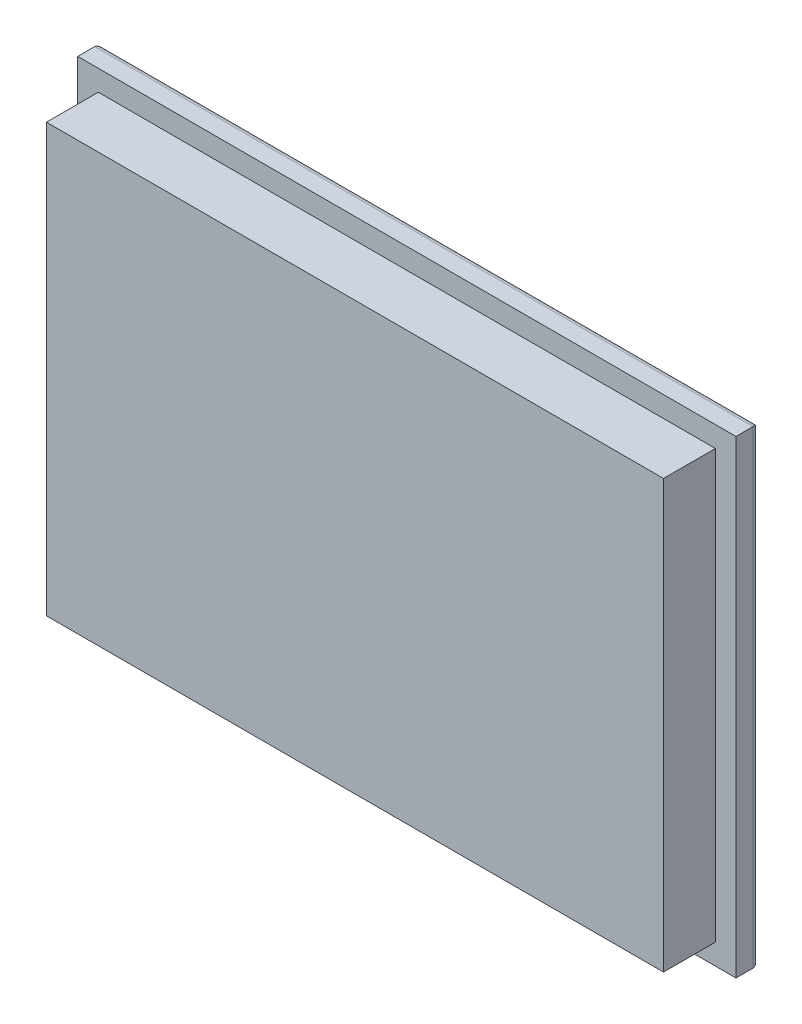
ISO-10303-21;
HEADER;
FILE_DESCRIPTION(('STEP AP214'),'2;1');
FILE_NAME('part.step','',(''),(''),'','','');
FILE_SCHEMA(('AUTOMOTIVE_DESIGN { 1 0 10303 214 1 1 1 1 }'));
ENDSEC;
DATA;
#1=APPLICATION_CONTEXT('core data for automotive mechanical design processes');
#2=APPLICATION_PROTOCOL_DEFINITION('international standard','automotive_design',2000,#1);
#3=PRODUCT_CONTEXT('',#1,'mechanical');
#4=PRODUCT('Part','Part','',(#3));
#5=PRODUCT_RELATED_PRODUCT_CATEGORY('part','',(#4));
#6=PRODUCT_DEFINITION_FORMATION('','',#4);
#7=PRODUCT_DEFINITION_CONTEXT('part definition',#1,'design');
#8=PRODUCT_DEFINITION('design','',#6,#7);
#9=PRODUCT_DEFINITION_SHAPE('','',#8);
#10=(LENGTH_UNIT() NAMED_UNIT(*) SI_UNIT(.MILLI.,.METRE.));
#11=(NAMED_UNIT(*) PLANE_ANGLE_UNIT() SI_UNIT($,.RADIAN.));
#12=(NAMED_UNIT(*) SI_UNIT($,.STERADIAN.) SOLID_ANGLE_UNIT());
#13=UNCERTAINTY_MEASURE_WITH_UNIT(LENGTH_MEASURE(1.E-05),#10,'distance_accuracy_value','');
#14=(GEOMETRIC_REPRESENTATION_CONTEXT(3) GLOBAL_UNCERTAINTY_ASSIGNED_CONTEXT((#13)) GLOBAL_UNIT_ASSIGNED_CONTEXT((#10,
#11,#12)) REPRESENTATION_CONTEXT('',''));
#15=CARTESIAN_POINT('',(0.,0.,0.));
#16=DIRECTION('',(0.,0.,1.));
#17=DIRECTION('',(1.,0.,0.));
#18=AXIS2_PLACEMENT_3D('',#15,#16,#17);
#19=CARTESIAN_POINT('',(0.,0.,7.4));
#20=DIRECTION('',(0.,0.,1.));
#21=DIRECTION('',(1.,0.,0.));
#22=AXIS2_PLACEMENT_3D('',#19,#20,#21);
#23=PLANE('',#22);
#24=DIRECTION('',(0.,-1.,0.));
#25=VECTOR('',#24,1.);
#26=CARTESIAN_POINT('',(-104.7,74.6,7.4));
#27=LINE('',#26,#25);
#28=CARTESIAN_POINT('',(-104.7,74.6,7.4));
#29=VERTEX_POINT('',#28);
#30=CARTESIAN_POINT('',(-104.7,-74.6,7.4));
#31=VERTEX_POINT('',#30);
#32=EDGE_CURVE('E247',#29,#31,#27,.T.);
#33=ORIENTED_EDGE('',*,*,#32,.T.);
#34=DIRECTION('',(1.,0.,0.));
#35=VECTOR('',#34,1.);
#36=CARTESIAN_POINT('',(-104.7,-74.6,7.4));
#37=LINE('',#36,#35);
#38=CARTESIAN_POINT('',(104.7,-74.6,7.4));
#39=VERTEX_POINT('',#38);
#40=EDGE_CURVE('E250',#31,#39,#37,.T.);
#41=ORIENTED_EDGE('',*,*,#40,.T.);
#42=DIRECTION('',(0.,1.,0.));
#43=VECTOR('',#42,1.);
#44=CARTESIAN_POINT('',(104.7,74.6,7.4));
#45=LINE('',#44,#43);
#46=CARTESIAN_POINT('',(104.7,74.6,7.4));
#47=VERTEX_POINT('',#46);
#48=EDGE_CURVE('E252',#39,#47,#45,.T.);
#49=ORIENTED_EDGE('',*,*,#48,.T.);
#50=DIRECTION('',(-1.,0.,0.));
#51=VECTOR('',#50,1.);
#52=CARTESIAN_POINT('',(-104.7,74.6,7.4));
#53=LINE('',#52,#51);
#54=EDGE_CURVE('E254',#47,#29,#53,.T.);
#55=ORIENTED_EDGE('',*,*,#54,.T.);
#56=EDGE_LOOP('',(#33,#41,#49,#55));
#57=FACE_BOUND('',#56,.T.);
#58=DIRECTION('',(1.,0.,0.));
#59=VECTOR('',#58,1.);
#60=CARTESIAN_POINT('',(-98.15,-68.,7.4));
#61=LINE('',#60,#59);
#62=CARTESIAN_POINT('',(-98.15,-68.,7.4));
#63=VERTEX_POINT('',#62);
#64=CARTESIAN_POINT('',(98.15,-68.,7.4));
#65=VERTEX_POINT('',#64);
#66=EDGE_CURVE('E232',#63,#65,#61,.T.);
#67=ORIENTED_EDGE('',*,*,#66,.F.);
#68=DIRECTION('',(0.,-1.,0.));
#69=VECTOR('',#68,1.);
#70=CARTESIAN_POINT('',(-98.15,68.,7.4));
#71=LINE('',#70,#69);
#72=CARTESIAN_POINT('',(-98.15,68.,7.4));
#73=VERTEX_POINT('',#72);
#74=EDGE_CURVE('E229',#73,#63,#71,.T.);
#75=ORIENTED_EDGE('',*,*,#74,.F.);
#76=DIRECTION('',(-1.,0.,0.));
#77=VECTOR('',#76,1.);
#78=CARTESIAN_POINT('',(-98.15,68.,7.4));
#79=LINE('',#78,#77);
#80=CARTESIAN_POINT('',(98.15,68.,7.4));
#81=VERTEX_POINT('',#80);
#82=EDGE_CURVE('E222',#81,#73,#79,.T.);
#83=ORIENTED_EDGE('',*,*,#82,.F.);
#84=DIRECTION('',(0.,1.,0.));
#85=VECTOR('',#84,1.);
#86=CARTESIAN_POINT('',(98.15,68.,7.4));
#87=LINE('',#86,#85);
#88=EDGE_CURVE('E234',#65,#81,#87,.T.);
#89=ORIENTED_EDGE('',*,*,#88,.F.);
#90=EDGE_LOOP('',(#67,#75,#83,#89));
#91=FACE_BOUND('',#90,.T.);
#92=ADVANCED_FACE('F34',(#57,#91),#23,.T.);
#93=CARTESIAN_POINT('',(-104.7,74.6,7.4));
#94=DIRECTION('',(1.,0.,0.));
#95=DIRECTION('',(0.,0.,-1.));
#96=AXIS2_PLACEMENT_3D('',#93,#94,#95);
#97=PLANE('',#96);
#98=DIRECTION('',(0.,0.,-1.));
#99=VECTOR('',#98,1.);
#100=CARTESIAN_POINT('',(-104.7,74.6,7.4));
#101=LINE('',#100,#99);
#102=CARTESIAN_POINT('',(-104.7,74.6,2.));
#103=VERTEX_POINT('',#102);
#104=EDGE_CURVE('E256',#29,#103,#101,.T.);
#105=ORIENTED_EDGE('',*,*,#104,.T.);
#106=DIRECTION('',(0.,-1.,0.));
#107=VECTOR('',#106,1.);
#108=CARTESIAN_POINT('',(-104.7,74.6,2.));
#109=LINE('',#108,#107);
#110=CARTESIAN_POINT('',(-104.7,-74.6,2.));
#111=VERTEX_POINT('',#110);
#112=EDGE_CURVE('E268',#103,#111,#109,.T.);
#113=ORIENTED_EDGE('',*,*,#112,.T.);
#114=DIRECTION('',(0.,0.,-1.));
#115=VECTOR('',#114,1.);
#116=CARTESIAN_POINT('',(-104.7,-74.6,7.4));
#117=LINE('',#116,#115);
#118=EDGE_CURVE('E265',#31,#111,#117,.T.);
#119=ORIENTED_EDGE('',*,*,#118,.F.);
#120=ORIENTED_EDGE('',*,*,#32,.F.);
#121=EDGE_LOOP('',(#105,#113,#119,#120));
#122=FACE_BOUND('',#121,.T.);
#123=ADVANCED_FACE('F392',(#122),#97,.F.);
#124=CARTESIAN_POINT('',(-104.7,-74.6,7.4));
#125=DIRECTION('',(0.,1.,0.));
#126=DIRECTION('',(-1.,0.,0.));
#127=AXIS2_PLACEMENT_3D('',#124,#125,#126);
#128=PLANE('',#127);
#129=ORIENTED_EDGE('',*,*,#118,.T.);
#130=DIRECTION('',(1.,0.,0.));
#131=VECTOR('',#130,1.);
#132=CARTESIAN_POINT('',(-104.7,-74.6,2.));
#133=LINE('',#132,#131);
#134=CARTESIAN_POINT('',(104.7,-74.6,2.));
#135=VERTEX_POINT('',#134);
#136=EDGE_CURVE('E280',#111,#135,#133,.T.);
#137=ORIENTED_EDGE('',*,*,#136,.T.);
#138=DIRECTION('',(0.,0.,-1.));
#139=VECTOR('',#138,1.);
#140=CARTESIAN_POINT('',(104.7,-74.6,7.4));
#141=LINE('',#140,#139);
#142=EDGE_CURVE('E262',#39,#135,#141,.T.);
#143=ORIENTED_EDGE('',*,*,#142,.F.);
#144=ORIENTED_EDGE('',*,*,#40,.F.);
#145=EDGE_LOOP('',(#129,#137,#143,#144));
#146=FACE_BOUND('',#145,.T.);
#147=ADVANCED_FACE('F398',(#146),#128,.F.);
#148=CARTESIAN_POINT('',(104.7,74.6,7.4));
#149=DIRECTION('',(-1.,0.,0.));
#150=DIRECTION('',(0.,-1.,0.));
#151=AXIS2_PLACEMENT_3D('',#148,#149,#150);
#152=PLANE('',#151);
#153=ORIENTED_EDGE('',*,*,#142,.T.);
#154=DIRECTION('',(0.,1.,0.));
#155=VECTOR('',#154,1.);
#156=CARTESIAN_POINT('',(104.7,74.6,2.));
#157=LINE('',#156,#155);
#158=CARTESIAN_POINT('',(104.7,74.6,2.));
#159=VERTEX_POINT('',#158);
#160=EDGE_CURVE('E282',#135,#159,#157,.T.);
#161=ORIENTED_EDGE('',*,*,#160,.T.);
#162=DIRECTION('',(0.,0.,-1.));
#163=VECTOR('',#162,1.);
#164=CARTESIAN_POINT('',(104.7,74.6,7.4));
#165=LINE('',#164,#163);
#166=EDGE_CURVE('E259',#47,#159,#165,.T.);
#167=ORIENTED_EDGE('',*,*,#166,.F.);
#168=ORIENTED_EDGE('',*,*,#48,.F.);
#169=EDGE_LOOP('',(#153,#161,#167,#168));
#170=FACE_BOUND('',#169,.T.);
#171=ADVANCED_FACE('F411',(#170),#152,.F.);
#172=CARTESIAN_POINT('',(-104.7,74.6,7.4));
#173=DIRECTION('',(0.,-1.,0.));
#174=DIRECTION('',(1.,0.,0.));
#175=AXIS2_PLACEMENT_3D('',#172,#173,#174);
#176=PLANE('',#175);
#177=ORIENTED_EDGE('',*,*,#166,.T.);
#178=DIRECTION('',(-1.,0.,0.));
#179=VECTOR('',#178,1.);
#180=CARTESIAN_POINT('',(-104.7,74.6,2.));
#181=LINE('',#180,#179);
#182=EDGE_CURVE('E192',#159,#103,#181,.T.);
#183=ORIENTED_EDGE('',*,*,#182,.T.);
#184=ORIENTED_EDGE('',*,*,#104,.F.);
#185=ORIENTED_EDGE('',*,*,#54,.F.);
#186=EDGE_LOOP('',(#177,#183,#184,#185));
#187=FACE_BOUND('',#186,.T.);
#188=ADVANCED_FACE('F408',(#187),#176,.F.);
#189=CARTESIAN_POINT('',(0.,0.,0.));
#190=DIRECTION('',(0.,0.,1.));
#191=DIRECTION('',(1.,0.,0.));
#192=AXIS2_PLACEMENT_3D('',#189,#190,#191);
#193=PLANE('',#192);
#194=DIRECTION('',(-1.,0.,0.));
#195=VECTOR('',#194,1.);
#196=CARTESIAN_POINT('',(99.7,-69.6,0.));
#197=LINE('',#196,#195);
#198=CARTESIAN_POINT('',(96.7,-69.6,0.));
#199=VERTEX_POINT('',#198);
#200=CARTESIAN_POINT('',(-96.7,-69.6,0.));
#201=VERTEX_POINT('',#200);
#202=EDGE_CURVE('E358',#199,#201,#197,.T.);
#203=ORIENTED_EDGE('',*,*,#202,.F.);
#204=CARTESIAN_POINT('',(96.7,-66.6,0.));
#205=DIRECTION('',(0.,0.,1.));
#206=DIRECTION('',(1.,0.,0.));
#207=AXIS2_PLACEMENT_3D('',#204,#205,#206);
#208=CIRCLE('',#207,3.);
#209=CARTESIAN_POINT('',(99.7,-66.6,0.));
#210=VERTEX_POINT('',#209);
#211=EDGE_CURVE('E11',#199,#210,#208,.T.);
#212=ORIENTED_EDGE('',*,*,#211,.T.);
#213=DIRECTION('',(0.,-1.,0.));
#214=VECTOR('',#213,1.);
#215=CARTESIAN_POINT('',(99.7,69.6,0.));
#216=LINE('',#215,#214);
#217=CARTESIAN_POINT('',(99.7,66.6,0.));
#218=VERTEX_POINT('',#217);
#219=EDGE_CURVE('E329',#218,#210,#216,.T.);
#220=ORIENTED_EDGE('',*,*,#219,.F.);
#221=CARTESIAN_POINT('',(96.7,66.6,0.));
#222=DIRECTION('',(0.,0.,1.));
#223=DIRECTION('',(1.,0.,0.));
#224=AXIS2_PLACEMENT_3D('',#221,#222,#223);
#225=CIRCLE('',#224,3.);
#226=CARTESIAN_POINT('',(96.7,69.6,0.));
#227=VERTEX_POINT('',#226);
#228=EDGE_CURVE('E42',#218,#227,#225,.T.);
#229=ORIENTED_EDGE('',*,*,#228,.T.);
#230=DIRECTION('',(1.,0.,0.));
#231=VECTOR('',#230,1.);
#232=CARTESIAN_POINT('',(99.7,69.6,0.));
#233=LINE('',#232,#231);
#234=CARTESIAN_POINT('',(-96.7,69.6,0.));
#235=VERTEX_POINT('',#234);
#236=EDGE_CURVE('E328',#235,#227,#233,.T.);
#237=ORIENTED_EDGE('',*,*,#236,.F.);
#238=CARTESIAN_POINT('',(-96.7,66.6,0.));
#239=DIRECTION('',(0.,0.,1.));
#240=DIRECTION('',(1.,0.,0.));
#241=AXIS2_PLACEMENT_3D('',#238,#239,#240);
#242=CIRCLE('',#241,3.);
#243=CARTESIAN_POINT('',(-99.7,66.6,0.));
#244=VERTEX_POINT('',#243);
#245=EDGE_CURVE('E323',#235,#244,#242,.T.);
#246=ORIENTED_EDGE('',*,*,#245,.T.);
#247=DIRECTION('',(0.,1.,0.));
#248=VECTOR('',#247,1.);
#249=CARTESIAN_POINT('',(-99.7,69.6,0.));
#250=LINE('',#249,#248);
#251=CARTESIAN_POINT('',(-99.7,-66.6,0.));
#252=VERTEX_POINT('',#251);
#253=EDGE_CURVE('E336',#252,#244,#250,.T.);
#254=ORIENTED_EDGE('',*,*,#253,.F.);
#255=CARTESIAN_POINT('',(-96.7,-66.6,0.));
#256=DIRECTION('',(0.,0.,1.));
#257=DIRECTION('',(1.,0.,0.));
#258=AXIS2_PLACEMENT_3D('',#255,#256,#257);
#259=CIRCLE('',#258,3.);
#260=EDGE_CURVE('E321',#252,#201,#259,.T.);
#261=ORIENTED_EDGE('',*,*,#260,.T.);
#262=EDGE_LOOP('',(#203,#212,#220,#229,#237,#246,#254,#261));
#263=FACE_BOUND('',#262,.T.);
#264=DIRECTION('',(1.,0.,0.));
#265=VECTOR('',#264,1.);
#266=CARTESIAN_POINT('',(0.,-72.6,0.));
#267=LINE('',#266,#265);
#268=CARTESIAN_POINT('',(102.7,-72.6,0.));
#269=VERTEX_POINT('',#268);
#270=CARTESIAN_POINT('',(-102.7,-72.6,0.));
#271=VERTEX_POINT('',#270);
#272=EDGE_CURVE('E275',#269,#271,#267,.F.);
#273=ORIENTED_EDGE('',*,*,#272,.T.);
#274=DIRECTION('',(0.,-1.,0.));
#275=VECTOR('',#274,1.);
#276=CARTESIAN_POINT('',(-102.7,0.,0.));
#277=LINE('',#276,#275);
#278=CARTESIAN_POINT('',(-102.7,72.6,0.));
#279=VERTEX_POINT('',#278);
#280=EDGE_CURVE('E277',#271,#279,#277,.F.);
#281=ORIENTED_EDGE('',*,*,#280,.T.);
#282=DIRECTION('',(-1.,0.,0.));
#283=VECTOR('',#282,1.);
#284=CARTESIAN_POINT('',(0.,72.6,0.));
#285=LINE('',#284,#283);
#286=CARTESIAN_POINT('',(102.7,72.6,0.));
#287=VERTEX_POINT('',#286);
#288=EDGE_CURVE('E271',#279,#287,#285,.F.);
#289=ORIENTED_EDGE('',*,*,#288,.T.);
#290=DIRECTION('',(0.,1.,0.));
#291=VECTOR('',#290,1.);
#292=CARTESIAN_POINT('',(102.7,0.,0.));
#293=LINE('',#292,#291);
#294=EDGE_CURVE('E273',#287,#269,#293,.F.);
#295=ORIENTED_EDGE('',*,*,#294,.T.);
#296=EDGE_LOOP('',(#273,#281,#289,#295));
#297=FACE_BOUND('',#296,.T.);
#298=ADVANCED_FACE('F326',(#263,#297),#193,.F.);
#299=CARTESIAN_POINT('',(-98.15,68.,23.9));
#300=DIRECTION('',(1.,0.,0.));
#301=DIRECTION('',(0.,1.,0.));
#302=AXIS2_PLACEMENT_3D('',#299,#300,#301);
#303=PLANE('',#302);
#304=ORIENTED_EDGE('',*,*,#74,.T.);
#305=DIRECTION('',(0.,0.,-1.));
#306=VECTOR('',#305,1.);
#307=CARTESIAN_POINT('',(-98.15,-68.,23.9));
#308=LINE('',#307,#306);
#309=CARTESIAN_POINT('',(-98.15,-68.,23.9));
#310=VERTEX_POINT('',#309);
#311=EDGE_CURVE('E245',#310,#63,#308,.T.);
#312=ORIENTED_EDGE('',*,*,#311,.F.);
#313=DIRECTION('',(0.,-1.,0.));
#314=VECTOR('',#313,1.);
#315=CARTESIAN_POINT('',(-98.15,68.,23.9));
#316=LINE('',#315,#314);
#317=CARTESIAN_POINT('',(-98.15,68.,23.9));
#318=VERTEX_POINT('',#317);
#319=EDGE_CURVE('E218',#318,#310,#316,.T.);
#320=ORIENTED_EDGE('',*,*,#319,.F.);
#321=DIRECTION('',(0.,0.,-1.));
#322=VECTOR('',#321,1.);
#323=CARTESIAN_POINT('',(-98.15,68.,23.9));
#324=LINE('',#323,#322);
#325=EDGE_CURVE('E228',#318,#73,#324,.T.);
#326=ORIENTED_EDGE('',*,*,#325,.T.);
#327=EDGE_LOOP('',(#304,#312,#320,#326));
#328=FACE_BOUND('',#327,.T.);
#329=ADVANCED_FACE('F404',(#328),#303,.F.);
#330=CARTESIAN_POINT('',(-98.15,-68.,23.9));
#331=DIRECTION('',(0.,1.,0.));
#332=DIRECTION('',(-1.,0.,0.));
#333=AXIS2_PLACEMENT_3D('',#330,#331,#332);
#334=PLANE('',#333);
#335=ORIENTED_EDGE('',*,*,#66,.T.);
#336=DIRECTION('',(0.,0.,-1.));
#337=VECTOR('',#336,1.);
#338=CARTESIAN_POINT('',(98.15,-68.,23.9));
#339=LINE('',#338,#337);
#340=CARTESIAN_POINT('',(98.15,-68.,23.9));
#341=VERTEX_POINT('',#340);
#342=EDGE_CURVE('E242',#341,#65,#339,.T.);
#343=ORIENTED_EDGE('',*,*,#342,.F.);
#344=DIRECTION('',(1.,0.,0.));
#345=VECTOR('',#344,1.);
#346=CARTESIAN_POINT('',(-98.15,-68.,23.9));
#347=LINE('',#346,#345);
#348=EDGE_CURVE('E221',#310,#341,#347,.T.);
#349=ORIENTED_EDGE('',*,*,#348,.F.);
#350=ORIENTED_EDGE('',*,*,#311,.T.);
#351=EDGE_LOOP('',(#335,#343,#349,#350));
#352=FACE_BOUND('',#351,.T.);
#353=ADVANCED_FACE('F514',(#352),#334,.F.);
#354=CARTESIAN_POINT('',(98.15,68.,23.9));
#355=DIRECTION('',(-1.,0.,0.));
#356=DIRECTION('',(0.,-1.,0.));
#357=AXIS2_PLACEMENT_3D('',#354,#355,#356);
#358=PLANE('',#357);
#359=ORIENTED_EDGE('',*,*,#88,.T.);
#360=DIRECTION('',(0.,0.,-1.));
#361=VECTOR('',#360,1.);
#362=CARTESIAN_POINT('',(98.15,68.,23.9));
#363=LINE('',#362,#361);
#364=CARTESIAN_POINT('',(98.15,68.,23.9));
#365=VERTEX_POINT('',#364);
#366=EDGE_CURVE('E240',#365,#81,#363,.T.);
#367=ORIENTED_EDGE('',*,*,#366,.F.);
#368=DIRECTION('',(0.,1.,0.));
#369=VECTOR('',#368,1.);
#370=CARTESIAN_POINT('',(98.15,68.,23.9));
#371=LINE('',#370,#369);
#372=EDGE_CURVE('E224',#341,#365,#371,.T.);
#373=ORIENTED_EDGE('',*,*,#372,.F.);
#374=ORIENTED_EDGE('',*,*,#342,.T.);
#375=EDGE_LOOP('',(#359,#367,#373,#374));
#376=FACE_BOUND('',#375,.T.);
#377=ADVANCED_FACE('F506',(#376),#358,.F.);
#378=CARTESIAN_POINT('',(-98.15,68.,23.9));
#379=DIRECTION('',(0.,-1.,0.));
#380=DIRECTION('',(1.,0.,0.));
#381=AXIS2_PLACEMENT_3D('',#378,#379,#380);
#382=PLANE('',#381);
#383=ORIENTED_EDGE('',*,*,#82,.T.);
#384=ORIENTED_EDGE('',*,*,#325,.F.);
#385=DIRECTION('',(-1.,0.,0.));
#386=VECTOR('',#385,1.);
#387=CARTESIAN_POINT('',(-98.15,68.,23.9));
#388=LINE('',#387,#386);
#389=EDGE_CURVE('E226',#365,#318,#388,.T.);
#390=ORIENTED_EDGE('',*,*,#389,.F.);
#391=ORIENTED_EDGE('',*,*,#366,.T.);
#392=EDGE_LOOP('',(#383,#384,#390,#391));
#393=FACE_BOUND('',#392,.T.);
#394=ADVANCED_FACE('F498',(#393),#382,.F.);
#395=CARTESIAN_POINT('',(0.,0.,23.9));
#396=DIRECTION('',(0.,0.,1.));
#397=DIRECTION('',(1.,0.,0.));
#398=AXIS2_PLACEMENT_3D('',#395,#396,#397);
#399=PLANE('',#398);
#400=ORIENTED_EDGE('',*,*,#319,.T.);
#401=ORIENTED_EDGE('',*,*,#348,.T.);
#402=ORIENTED_EDGE('',*,*,#372,.T.);
#403=ORIENTED_EDGE('',*,*,#389,.T.);
#404=EDGE_LOOP('',(#400,#401,#402,#403));
#405=FACE_BOUND('',#404,.T.);
#406=ADVANCED_FACE('F434',(#405),#399,.T.);
#407=CARTESIAN_POINT('',(102.7,74.6,2.));
#408=DIRECTION('',(0.,1.,0.));
#409=DIRECTION('',(-1.,0.,0.));
#410=AXIS2_PLACEMENT_3D('',#407,#408,#409);
#411=CYLINDRICAL_SURFACE('',#410,2.);
#412=CARTESIAN_POINT('',(102.7,-72.6,2.));
#413=DIRECTION('',(0.707106781186547,0.707106781186548,0.));
#414=DIRECTION('',(-0.707106781186548,0.707106781186547,0.));
#415=AXIS2_PLACEMENT_3D('',#412,#413,#414);
#416=ELLIPSE('',#415,2.82842712474619,2.);
#417=EDGE_CURVE('E288',#269,#135,#416,.F.);
#418=ORIENTED_EDGE('',*,*,#417,.F.);
#419=ORIENTED_EDGE('',*,*,#294,.F.);
#420=CARTESIAN_POINT('',(102.7,72.6,2.));
#421=DIRECTION('',(-0.707106781186548,0.707106781186547,0.));
#422=DIRECTION('',(-0.707106781186547,-0.707106781186548,0.));
#423=AXIS2_PLACEMENT_3D('',#420,#421,#422);
#424=ELLIPSE('',#423,2.82842712474619,2.);
#425=EDGE_CURVE('E291',#159,#287,#424,.T.);
#426=ORIENTED_EDGE('',*,*,#425,.F.);
#427=ORIENTED_EDGE('',*,*,#160,.F.);
#428=EDGE_LOOP('',(#418,#419,#426,#427));
#429=FACE_BOUND('',#428,.T.);
#430=ADVANCED_FACE('F430',(#429),#411,.T.);
#431=CARTESIAN_POINT('',(-104.7,72.6,2.));
#432=DIRECTION('',(-1.,0.,0.));
#433=DIRECTION('',(0.,-1.,0.));
#434=AXIS2_PLACEMENT_3D('',#431,#432,#433);
#435=CYLINDRICAL_SURFACE('',#434,2.);
#436=ORIENTED_EDGE('',*,*,#425,.T.);
#437=ORIENTED_EDGE('',*,*,#288,.F.);
#438=CARTESIAN_POINT('',(-102.7,72.6,2.));
#439=DIRECTION('',(-0.707106781186547,-0.707106781186547,0.));
#440=DIRECTION('',(-0.707106781186548,0.707106781186547,0.));
#441=AXIS2_PLACEMENT_3D('',#438,#439,#440);
#442=ELLIPSE('',#441,2.82842712474619,2.);
#443=EDGE_CURVE('E286',#103,#279,#442,.T.);
#444=ORIENTED_EDGE('',*,*,#443,.F.);
#445=ORIENTED_EDGE('',*,*,#182,.F.);
#446=EDGE_LOOP('',(#436,#437,#444,#445));
#447=FACE_BOUND('',#446,.T.);
#448=ADVANCED_FACE('F426',(#447),#435,.T.);
#449=CARTESIAN_POINT('',(-104.7,-72.6,2.));
#450=DIRECTION('',(1.,0.,0.));
#451=DIRECTION('',(0.,1.,0.));
#452=AXIS2_PLACEMENT_3D('',#449,#450,#451);
#453=CYLINDRICAL_SURFACE('',#452,2.);
#454=ORIENTED_EDGE('',*,*,#417,.T.);
#455=ORIENTED_EDGE('',*,*,#136,.F.);
#456=CARTESIAN_POINT('',(-102.7,-72.6,2.));
#457=DIRECTION('',(0.707106781186548,-0.707106781186547,0.));
#458=DIRECTION('',(0.707106781186547,0.707106781186548,0.));
#459=AXIS2_PLACEMENT_3D('',#456,#457,#458);
#460=ELLIPSE('',#459,2.82842712474619,2.);
#461=EDGE_CURVE('E201',#271,#111,#460,.F.);
#462=ORIENTED_EDGE('',*,*,#461,.F.);
#463=ORIENTED_EDGE('',*,*,#272,.F.);
#464=EDGE_LOOP('',(#454,#455,#462,#463));
#465=FACE_BOUND('',#464,.T.);
#466=ADVANCED_FACE('F422',(#465),#453,.T.);
#467=CARTESIAN_POINT('',(-102.7,74.6,2.));
#468=DIRECTION('',(0.,-1.,0.));
#469=DIRECTION('',(0.,0.,-1.));
#470=AXIS2_PLACEMENT_3D('',#467,#468,#469);
#471=CYLINDRICAL_SURFACE('',#470,2.);
#472=ORIENTED_EDGE('',*,*,#443,.T.);
#473=ORIENTED_EDGE('',*,*,#280,.F.);
#474=ORIENTED_EDGE('',*,*,#461,.T.);
#475=ORIENTED_EDGE('',*,*,#112,.F.);
#476=EDGE_LOOP('',(#472,#473,#474,#475));
#477=FACE_BOUND('',#476,.T.);
#478=ADVANCED_FACE('F419',(#477),#471,.T.);
#479=CARTESIAN_POINT('',(0.,0.,0.5));
#480=DIRECTION('',(0.,0.,-1.));
#481=DIRECTION('',(-1.,0.,0.));
#482=AXIS2_PLACEMENT_3D('',#479,#480,#481);
#483=PLANE('',#482);
#484=DIRECTION('',(-1.,0.,0.));
#485=VECTOR('',#484,1.);
#486=CARTESIAN_POINT('',(99.7,-69.6,0.5));
#487=LINE('',#486,#485);
#488=CARTESIAN_POINT('',(96.7,-69.6,0.5));
#489=VERTEX_POINT('',#488);
#490=CARTESIAN_POINT('',(-96.7,-69.6,0.5));
#491=VERTEX_POINT('',#490);
#492=EDGE_CURVE('E349',#489,#491,#487,.T.);
#493=ORIENTED_EDGE('',*,*,#492,.T.);
#494=CARTESIAN_POINT('',(-96.7,-66.6,0.5));
#495=DIRECTION('',(0.,0.,-1.));
#496=DIRECTION('',(-1.,0.,0.));
#497=AXIS2_PLACEMENT_3D('',#494,#495,#496);
#498=CIRCLE('',#497,3.);
#499=CARTESIAN_POINT('',(-99.7,-66.6,0.5));
#500=VERTEX_POINT('',#499);
#501=EDGE_CURVE('E310',#491,#500,#498,.T.);
#502=ORIENTED_EDGE('',*,*,#501,.T.);
#503=DIRECTION('',(0.,1.,0.));
#504=VECTOR('',#503,1.);
#505=CARTESIAN_POINT('',(-99.7,69.6,0.5));
#506=LINE('',#505,#504);
#507=CARTESIAN_POINT('',(-99.7,66.6,0.5));
#508=VERTEX_POINT('',#507);
#509=EDGE_CURVE('E351',#500,#508,#506,.T.);
#510=ORIENTED_EDGE('',*,*,#509,.T.);
#511=CARTESIAN_POINT('',(-96.7,66.6,0.5));
#512=DIRECTION('',(0.,0.,-1.));
#513=DIRECTION('',(-1.,0.,0.));
#514=AXIS2_PLACEMENT_3D('',#511,#512,#513);
#515=CIRCLE('',#514,3.);
#516=CARTESIAN_POINT('',(-96.7,69.6,0.5));
#517=VERTEX_POINT('',#516);
#518=EDGE_CURVE('E308',#508,#517,#515,.T.);
#519=ORIENTED_EDGE('',*,*,#518,.T.);
#520=DIRECTION('',(1.,0.,0.));
#521=VECTOR('',#520,1.);
#522=CARTESIAN_POINT('',(99.7,69.6,0.5));
#523=LINE('',#522,#521);
#524=CARTESIAN_POINT('',(96.7,69.6,0.5));
#525=VERTEX_POINT('',#524);
#526=EDGE_CURVE('E345',#517,#525,#523,.T.);
#527=ORIENTED_EDGE('',*,*,#526,.T.);
#528=CARTESIAN_POINT('',(96.7,66.6,0.5));
#529=DIRECTION('',(0.,0.,-1.));
#530=DIRECTION('',(-1.,0.,0.));
#531=AXIS2_PLACEMENT_3D('',#528,#529,#530);
#532=CIRCLE('',#531,3.);
#533=CARTESIAN_POINT('',(99.7,66.6,0.5));
#534=VERTEX_POINT('',#533);
#535=EDGE_CURVE('E306',#525,#534,#532,.T.);
#536=ORIENTED_EDGE('',*,*,#535,.T.);
#537=DIRECTION('',(0.,-1.,0.));
#538=VECTOR('',#537,1.);
#539=CARTESIAN_POINT('',(99.7,69.6,0.5));
#540=LINE('',#539,#538);
#541=CARTESIAN_POINT('',(99.7,-66.6,0.5));
#542=VERTEX_POINT('',#541);
#543=EDGE_CURVE('E335',#534,#542,#540,.T.);
#544=ORIENTED_EDGE('',*,*,#543,.T.);
#545=CARTESIAN_POINT('',(96.7,-66.6,0.5));
#546=DIRECTION('',(0.,0.,-1.));
#547=DIRECTION('',(-1.,0.,0.));
#548=AXIS2_PLACEMENT_3D('',#545,#546,#547);
#549=CIRCLE('',#548,3.);
#550=EDGE_CURVE('E304',#542,#489,#549,.T.);
#551=ORIENTED_EDGE('',*,*,#550,.T.);
#552=EDGE_LOOP('',(#493,#502,#510,#519,#527,#536,#544,#551));
#553=FACE_BOUND('',#552,.T.);
#554=DIRECTION('',(0.,1.,0.));
#555=VECTOR('',#554,1.);
#556=CARTESIAN_POINT('',(78.25,49.15,0.5));
#557=LINE('',#556,#555);
#558=CARTESIAN_POINT('',(78.25,-36.75,0.5));
#559=VERTEX_POINT('',#558);
#560=CARTESIAN_POINT('',(78.25,49.15,0.5));
#561=VERTEX_POINT('',#560);
#562=EDGE_CURVE('E184',#559,#561,#557,.T.);
#563=ORIENTED_EDGE('',*,*,#562,.T.);
#564=DIRECTION('',(-1.,0.,0.));
#565=VECTOR('',#564,1.);
#566=CARTESIAN_POINT('',(78.25,49.15,0.5));
#567=LINE('',#566,#565);
#568=CARTESIAN_POINT('',(-75.85,49.15,0.5));
#569=VERTEX_POINT('',#568);
#570=EDGE_CURVE('E202',#561,#569,#567,.T.);
#571=ORIENTED_EDGE('',*,*,#570,.T.);
#572=DIRECTION('',(0.,-1.,0.));
#573=VECTOR('',#572,1.);
#574=CARTESIAN_POINT('',(-75.85,49.15,0.5));
#575=LINE('',#574,#573);
#576=CARTESIAN_POINT('',(-75.85,-36.75,0.5));
#577=VERTEX_POINT('',#576);
#578=EDGE_CURVE('E187',#569,#577,#575,.T.);
#579=ORIENTED_EDGE('',*,*,#578,.T.);
#580=DIRECTION('',(1.,0.,0.));
#581=VECTOR('',#580,1.);
#582=CARTESIAN_POINT('',(78.25,-36.75,0.5));
#583=LINE('',#582,#581);
#584=EDGE_CURVE('E181',#577,#559,#583,.T.);
#585=ORIENTED_EDGE('',*,*,#584,.T.);
#586=EDGE_LOOP('',(#563,#571,#579,#585));
#587=FACE_BOUND('',#586,.T.);
#588=ADVANCED_FACE('F183',(#553,#587),#483,.T.);
#589=CARTESIAN_POINT('',(99.7,69.6,0.5));
#590=DIRECTION('',(1.,0.,0.));
#591=DIRECTION('',(0.,0.,-1.));
#592=AXIS2_PLACEMENT_3D('',#589,#590,#591);
#593=PLANE('',#592);
#594=ORIENTED_EDGE('',*,*,#543,.F.);
#595=DIRECTION('',(0.,0.,-1.));
#596=VECTOR('',#595,1.);
#597=CARTESIAN_POINT('',(99.7,66.6,0.));
#598=LINE('',#597,#596);
#599=EDGE_CURVE('E319',#534,#218,#598,.T.);
#600=ORIENTED_EDGE('',*,*,#599,.T.);
#601=ORIENTED_EDGE('',*,*,#219,.T.);
#602=DIRECTION('',(0.,0.,-1.));
#603=VECTOR('',#602,1.);
#604=CARTESIAN_POINT('',(99.7,-66.6,0.5));
#605=LINE('',#604,#603);
#606=EDGE_CURVE('E317',#210,#542,#605,.F.);
#607=ORIENTED_EDGE('',*,*,#606,.T.);
#608=EDGE_LOOP('',(#594,#600,#601,#607));
#609=FACE_BOUND('',#608,.T.);
#610=ADVANCED_FACE('F347',(#609),#593,.F.);
#611=CARTESIAN_POINT('',(99.7,69.6,0.5));
#612=DIRECTION('',(0.,1.,0.));
#613=DIRECTION('',(-1.,0.,0.));
#614=AXIS2_PLACEMENT_3D('',#611,#612,#613);
#615=PLANE('',#614);
#616=ORIENTED_EDGE('',*,*,#526,.F.);
#617=DIRECTION('',(0.,0.,-1.));
#618=VECTOR('',#617,1.);
#619=CARTESIAN_POINT('',(-96.7,69.6,0.));
#620=LINE('',#619,#618);
#621=EDGE_CURVE('E314',#517,#235,#620,.T.);
#622=ORIENTED_EDGE('',*,*,#621,.T.);
#623=ORIENTED_EDGE('',*,*,#236,.T.);
#624=DIRECTION('',(0.,0.,-1.));
#625=VECTOR('',#624,1.);
#626=CARTESIAN_POINT('',(96.7,69.6,0.5));
#627=LINE('',#626,#625);
#628=EDGE_CURVE('E312',#227,#525,#627,.F.);
#629=ORIENTED_EDGE('',*,*,#628,.T.);
#630=EDGE_LOOP('',(#616,#622,#623,#629));
#631=FACE_BOUND('',#630,.T.);
#632=ADVANCED_FACE('F332',(#631),#615,.F.);
#633=CARTESIAN_POINT('',(-99.7,69.6,0.5));
#634=DIRECTION('',(-1.,0.,0.));
#635=DIRECTION('',(0.,0.,1.));
#636=AXIS2_PLACEMENT_3D('',#633,#634,#635);
#637=PLANE('',#636);
#638=ORIENTED_EDGE('',*,*,#509,.F.);
#639=DIRECTION('',(0.,0.,-1.));
#640=VECTOR('',#639,1.);
#641=CARTESIAN_POINT('',(-99.7,-66.6,0.));
#642=LINE('',#641,#640);
#643=EDGE_CURVE('E296',#500,#252,#642,.T.);
#644=ORIENTED_EDGE('',*,*,#643,.T.);
#645=ORIENTED_EDGE('',*,*,#253,.T.);
#646=DIRECTION('',(0.,0.,-1.));
#647=VECTOR('',#646,1.);
#648=CARTESIAN_POINT('',(-99.7,66.6,0.5));
#649=LINE('',#648,#647);
#650=EDGE_CURVE('E191',#244,#508,#649,.F.);
#651=ORIENTED_EDGE('',*,*,#650,.T.);
#652=EDGE_LOOP('',(#638,#644,#645,#651));
#653=FACE_BOUND('',#652,.T.);
#654=ADVANCED_FACE('F386',(#653),#637,.F.);
#655=CARTESIAN_POINT('',(99.7,-69.6,0.5));
#656=DIRECTION('',(0.,-1.,0.));
#657=DIRECTION('',(1.,0.,0.));
#658=AXIS2_PLACEMENT_3D('',#655,#656,#657);
#659=PLANE('',#658);
#660=ORIENTED_EDGE('',*,*,#202,.T.);
#661=DIRECTION('',(0.,0.,-1.));
#662=VECTOR('',#661,1.);
#663=CARTESIAN_POINT('',(-96.7,-69.6,0.5));
#664=LINE('',#663,#662);
#665=EDGE_CURVE('E302',#201,#491,#664,.F.);
#666=ORIENTED_EDGE('',*,*,#665,.T.);
#667=ORIENTED_EDGE('',*,*,#492,.F.);
#668=DIRECTION('',(0.,0.,-1.));
#669=VECTOR('',#668,1.);
#670=CARTESIAN_POINT('',(96.7,-69.6,0.));
#671=LINE('',#670,#669);
#672=EDGE_CURVE('E299',#489,#199,#671,.T.);
#673=ORIENTED_EDGE('',*,*,#672,.T.);
#674=EDGE_LOOP('',(#660,#666,#667,#673));
#675=FACE_BOUND('',#674,.T.);
#676=ADVANCED_FACE('F379',(#675),#659,.F.);
#677=CARTESIAN_POINT('',(0.,0.,1.5));
#678=DIRECTION('',(0.,0.,-1.));
#679=DIRECTION('',(-1.,0.,0.));
#680=AXIS2_PLACEMENT_3D('',#677,#678,#679);
#681=PLANE('',#680);
#682=DIRECTION('',(0.,-1.,0.));
#683=VECTOR('',#682,1.);
#684=CARTESIAN_POINT('',(78.25,49.15,1.5));
#685=LINE('',#684,#683);
#686=CARTESIAN_POINT('',(78.25,49.15,1.5));
#687=VERTEX_POINT('',#686);
#688=CARTESIAN_POINT('',(78.25,-36.75,1.5));
#689=VERTEX_POINT('',#688);
#690=EDGE_CURVE('E293',#687,#689,#685,.T.);
#691=ORIENTED_EDGE('',*,*,#690,.T.);
#692=DIRECTION('',(-1.,0.,0.));
#693=VECTOR('',#692,1.);
#694=CARTESIAN_POINT('',(78.25,-36.75,1.5));
#695=LINE('',#694,#693);
#696=CARTESIAN_POINT('',(-75.85,-36.75,1.5));
#697=VERTEX_POINT('',#696);
#698=EDGE_CURVE('E206',#689,#697,#695,.T.);
#699=ORIENTED_EDGE('',*,*,#698,.T.);
#700=DIRECTION('',(0.,1.,0.));
#701=VECTOR('',#700,1.);
#702=CARTESIAN_POINT('',(-75.85,49.15,1.5));
#703=LINE('',#702,#701);
#704=CARTESIAN_POINT('',(-75.85,49.15,1.5));
#705=VERTEX_POINT('',#704);
#706=EDGE_CURVE('E214',#697,#705,#703,.T.);
#707=ORIENTED_EDGE('',*,*,#706,.T.);
#708=DIRECTION('',(1.,0.,0.));
#709=VECTOR('',#708,1.);
#710=CARTESIAN_POINT('',(78.25,49.15,1.5));
#711=LINE('',#710,#709);
#712=EDGE_CURVE('E209',#705,#687,#711,.T.);
#713=ORIENTED_EDGE('',*,*,#712,.T.);
#714=EDGE_LOOP('',(#691,#699,#707,#713));
#715=FACE_BOUND('',#714,.T.);
#716=ADVANCED_FACE('F377',(#715),#681,.T.);
#717=CARTESIAN_POINT('',(78.25,-36.75,1.5));
#718=DIRECTION('',(0.,-1.,0.));
#719=DIRECTION('',(1.,0.,0.));
#720=AXIS2_PLACEMENT_3D('',#717,#718,#719);
#721=PLANE('',#720);
#722=ORIENTED_EDGE('',*,*,#584,.F.);
#723=DIRECTION('',(0.,0.,-1.));
#724=VECTOR('',#723,1.);
#725=CARTESIAN_POINT('',(-75.85,-36.75,1.5));
#726=LINE('',#725,#724);
#727=EDGE_CURVE('E208',#697,#577,#726,.T.);
#728=ORIENTED_EDGE('',*,*,#727,.F.);
#729=ORIENTED_EDGE('',*,*,#698,.F.);
#730=DIRECTION('',(0.,0.,-1.));
#731=VECTOR('',#730,1.);
#732=CARTESIAN_POINT('',(78.25,-36.75,1.5));
#733=LINE('',#732,#731);
#734=EDGE_CURVE('E198',#689,#559,#733,.T.);
#735=ORIENTED_EDGE('',*,*,#734,.T.);
#736=EDGE_LOOP('',(#722,#728,#729,#735));
#737=FACE_BOUND('',#736,.T.);
#738=ADVANCED_FACE('F204',(#737),#721,.F.);
#739=CARTESIAN_POINT('',(-75.85,49.15,1.5));
#740=DIRECTION('',(-1.,0.,0.));
#741=DIRECTION('',(0.,-1.,0.));
#742=AXIS2_PLACEMENT_3D('',#739,#740,#741);
#743=PLANE('',#742);
#744=ORIENTED_EDGE('',*,*,#578,.F.);
#745=DIRECTION('',(0.,0.,-1.));
#746=VECTOR('',#745,1.);
#747=CARTESIAN_POINT('',(-75.85,49.15,1.5));
#748=LINE('',#747,#746);
#749=EDGE_CURVE('E211',#705,#569,#748,.T.);
#750=ORIENTED_EDGE('',*,*,#749,.F.);
#751=ORIENTED_EDGE('',*,*,#706,.F.);
#752=ORIENTED_EDGE('',*,*,#727,.T.);
#753=EDGE_LOOP('',(#744,#750,#751,#752));
#754=FACE_BOUND('',#753,.T.);
#755=ADVANCED_FACE('F375',(#754),#743,.F.);
#756=CARTESIAN_POINT('',(78.25,49.15,1.5));
#757=DIRECTION('',(0.,1.,0.));
#758=DIRECTION('',(0.,0.,1.));
#759=AXIS2_PLACEMENT_3D('',#756,#757,#758);
#760=PLANE('',#759);
#761=ORIENTED_EDGE('',*,*,#570,.F.);
#762=DIRECTION('',(0.,0.,-1.));
#763=VECTOR('',#762,1.);
#764=CARTESIAN_POINT('',(78.25,49.15,1.5));
#765=LINE('',#764,#763);
#766=EDGE_CURVE('E200',#687,#561,#765,.T.);
#767=ORIENTED_EDGE('',*,*,#766,.F.);
#768=ORIENTED_EDGE('',*,*,#712,.F.);
#769=ORIENTED_EDGE('',*,*,#749,.T.);
#770=EDGE_LOOP('',(#761,#767,#768,#769));
#771=FACE_BOUND('',#770,.T.);
#772=ADVANCED_FACE('F372',(#771),#760,.F.);
#773=CARTESIAN_POINT('',(78.25,49.15,1.5));
#774=DIRECTION('',(1.,0.,0.));
#775=DIRECTION('',(0.,1.,0.));
#776=AXIS2_PLACEMENT_3D('',#773,#774,#775);
#777=PLANE('',#776);
#778=ORIENTED_EDGE('',*,*,#562,.F.);
#779=ORIENTED_EDGE('',*,*,#734,.F.);
#780=ORIENTED_EDGE('',*,*,#690,.F.);
#781=ORIENTED_EDGE('',*,*,#766,.T.);
#782=EDGE_LOOP('',(#778,#779,#780,#781));
#783=FACE_BOUND('',#782,.T.);
#784=ADVANCED_FACE('F196',(#783),#777,.F.);
#785=CARTESIAN_POINT('',(-96.7,-66.6,0.5));
#786=DIRECTION('',(0.,0.,1.));
#787=DIRECTION('',(1.,0.,0.));
#788=AXIS2_PLACEMENT_3D('',#785,#786,#787);
#789=CYLINDRICAL_SURFACE('',#788,3.);
#790=ORIENTED_EDGE('',*,*,#501,.F.);
#791=ORIENTED_EDGE('',*,*,#665,.F.);
#792=ORIENTED_EDGE('',*,*,#260,.F.);
#793=ORIENTED_EDGE('',*,*,#643,.F.);
#794=EDGE_LOOP('',(#790,#791,#792,#793));
#795=FACE_BOUND('',#794,.T.);
#796=ADVANCED_FACE('F436',(#795),#789,.F.);
#797=CARTESIAN_POINT('',(-96.7,66.6,0.5));
#798=DIRECTION('',(0.,0.,1.));
#799=DIRECTION('',(1.,0.,0.));
#800=AXIS2_PLACEMENT_3D('',#797,#798,#799);
#801=CYLINDRICAL_SURFACE('',#800,3.);
#802=ORIENTED_EDGE('',*,*,#518,.F.);
#803=ORIENTED_EDGE('',*,*,#650,.F.);
#804=ORIENTED_EDGE('',*,*,#245,.F.);
#805=ORIENTED_EDGE('',*,*,#621,.F.);
#806=EDGE_LOOP('',(#802,#803,#804,#805));
#807=FACE_BOUND('',#806,.T.);
#808=ADVANCED_FACE('F439',(#807),#801,.F.);
#809=CARTESIAN_POINT('',(96.7,66.6,0.5));
#810=DIRECTION('',(0.,0.,1.));
#811=DIRECTION('',(1.,0.,0.));
#812=AXIS2_PLACEMENT_3D('',#809,#810,#811);
#813=CYLINDRICAL_SURFACE('',#812,3.);
#814=ORIENTED_EDGE('',*,*,#535,.F.);
#815=ORIENTED_EDGE('',*,*,#628,.F.);
#816=ORIENTED_EDGE('',*,*,#228,.F.);
#817=ORIENTED_EDGE('',*,*,#599,.F.);
#818=EDGE_LOOP('',(#814,#815,#816,#817));
#819=FACE_BOUND('',#818,.T.);
#820=ADVANCED_FACE('F339',(#819),#813,.F.);
#821=CARTESIAN_POINT('',(96.7,-66.6,0.5));
#822=DIRECTION('',(0.,0.,1.));
#823=DIRECTION('',(1.,0.,0.));
#824=AXIS2_PLACEMENT_3D('',#821,#822,#823);
#825=CYLINDRICAL_SURFACE('',#824,3.);
#826=ORIENTED_EDGE('',*,*,#550,.F.);
#827=ORIENTED_EDGE('',*,*,#606,.F.);
#828=ORIENTED_EDGE('',*,*,#211,.F.);
#829=ORIENTED_EDGE('',*,*,#672,.F.);
#830=EDGE_LOOP('',(#826,#827,#828,#829));
#831=FACE_BOUND('',#830,.T.);
#832=ADVANCED_FACE('F36',(#831),#825,.F.);
#833=CLOSED_SHELL('',(#92,#123,#147,#171,#188,#298,#329,#353,#377,#394,#406,#430,#448,#466,#478,
#588,#610,#632,#654,#676,#716,#738,#755,#772,#784,#796,#808,#820,#832));
#834=MANIFOLD_SOLID_BREP('B2',#833);
#835=ADVANCED_BREP_SHAPE_REPRESENTATION('',(#18,#834),#14);
#836=SHAPE_DEFINITION_REPRESENTATION(#9,#835);
ENDSEC;
END-ISO-10303-21;
